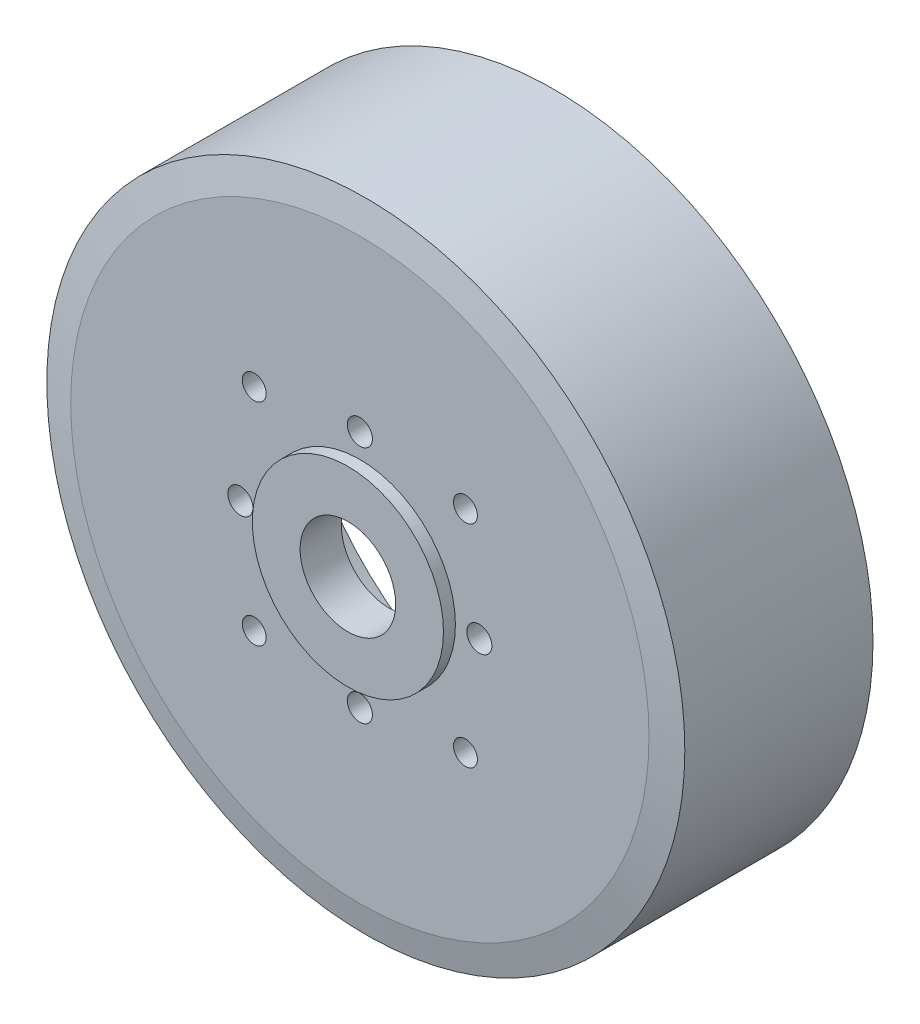
ISO-10303-21;
HEADER;
FILE_DESCRIPTION(('STEP AP214'),'2;1');
FILE_NAME('part.step','',(''),(''),'','','');
FILE_SCHEMA(('AUTOMOTIVE_DESIGN { 1 0 10303 214 1 1 1 1 }'));
ENDSEC;
DATA;
#1=APPLICATION_CONTEXT('core data for automotive mechanical design processes');
#2=APPLICATION_PROTOCOL_DEFINITION('international standard','automotive_design',2000,#1);
#3=PRODUCT_CONTEXT('',#1,'mechanical');
#4=PRODUCT('Part','Part','',(#3));
#5=PRODUCT_RELATED_PRODUCT_CATEGORY('part','',(#4));
#6=PRODUCT_DEFINITION_FORMATION('','',#4);
#7=PRODUCT_DEFINITION_CONTEXT('part definition',#1,'design');
#8=PRODUCT_DEFINITION('design','',#6,#7);
#9=PRODUCT_DEFINITION_SHAPE('','',#8);
#10=(LENGTH_UNIT() NAMED_UNIT(*) SI_UNIT(.MILLI.,.METRE.));
#11=(NAMED_UNIT(*) PLANE_ANGLE_UNIT() SI_UNIT($,.RADIAN.));
#12=(NAMED_UNIT(*) SI_UNIT($,.STERADIAN.) SOLID_ANGLE_UNIT());
#13=UNCERTAINTY_MEASURE_WITH_UNIT(LENGTH_MEASURE(1.E-05),#10,'distance_accuracy_value','');
#14=(GEOMETRIC_REPRESENTATION_CONTEXT(3) GLOBAL_UNCERTAINTY_ASSIGNED_CONTEXT((#13)) GLOBAL_UNIT_ASSIGNED_CONTEXT((#10,
#11,#12)) REPRESENTATION_CONTEXT('',''));
#15=CARTESIAN_POINT('',(0.,0.,0.));
#16=DIRECTION('',(0.,0.,1.));
#17=DIRECTION('',(1.,0.,0.));
#18=AXIS2_PLACEMENT_3D('',#15,#16,#17);
#19=CARTESIAN_POINT('',(0.,0.,-38.5));
#20=DIRECTION('',(0.,0.,1.));
#21=DIRECTION('',(1.,0.,0.));
#22=AXIS2_PLACEMENT_3D('',#19,#20,#21);
#23=CYLINDRICAL_SURFACE('',#22,8.);
#24=CARTESIAN_POINT('',(0.,0.,2.));
#25=DIRECTION('',(0.,0.,1.));
#26=DIRECTION('',(1.,0.,0.));
#27=AXIS2_PLACEMENT_3D('',#24,#25,#26);
#28=CIRCLE('',#27,8.);
#29=CARTESIAN_POINT('',(8.,0.,2.));
#30=VERTEX_POINT('',#29);
#31=EDGE_CURVE('E74',#30,#30,#28,.T.);
#32=ORIENTED_EDGE('',*,*,#31,.T.);
#33=EDGE_LOOP('',(#32));
#34=FACE_BOUND('',#33,.T.);
#35=CARTESIAN_POINT('',(0.,0.,-4.9));
#36=DIRECTION('',(0.,0.,-1.));
#37=DIRECTION('',(-1.,0.,0.));
#38=AXIS2_PLACEMENT_3D('',#35,#36,#37);
#39=CIRCLE('',#38,8.);
#40=CARTESIAN_POINT('',(-8.,0.,-4.9));
#41=VERTEX_POINT('',#40);
#42=EDGE_CURVE('E101',#41,#41,#39,.F.);
#43=ORIENTED_EDGE('',*,*,#42,.F.);
#44=EDGE_LOOP('',(#43));
#45=FACE_BOUND('',#44,.T.);
#46=ADVANCED_FACE('F37',(#34,#45),#23,.F.);
#47=CARTESIAN_POINT('',(17.6776695296637,-17.6776695296637,-20.));
#48=DIRECTION('',(0.,0.,1.));
#49=DIRECTION('',(1.,0.,0.));
#50=AXIS2_PLACEMENT_3D('',#47,#48,#49);
#51=CYLINDRICAL_SURFACE('',#50,2.);
#52=CARTESIAN_POINT('',(17.6776695296637,-17.6776695296637,0.));
#53=DIRECTION('',(0.,0.,1.));
#54=DIRECTION('',(1.,0.,0.));
#55=AXIS2_PLACEMENT_3D('',#52,#53,#54);
#56=CIRCLE('',#55,2.);
#57=CARTESIAN_POINT('',(19.6776695296637,-17.6776695296637,0.));
#58=VERTEX_POINT('',#57);
#59=EDGE_CURVE('E51',#58,#58,#56,.T.);
#60=ORIENTED_EDGE('',*,*,#59,.T.);
#61=EDGE_LOOP('',(#60));
#62=FACE_BOUND('',#61,.T.);
#63=CARTESIAN_POINT('',(17.6776695296637,-17.6776695296637,-4.9));
#64=DIRECTION('',(0.,0.,-1.));
#65=DIRECTION('',(-1.,0.,0.));
#66=AXIS2_PLACEMENT_3D('',#63,#64,#65);
#67=CIRCLE('',#66,2.);
#68=CARTESIAN_POINT('',(15.6776695296637,-17.6776695296637,-4.9));
#69=VERTEX_POINT('',#68);
#70=EDGE_CURVE('E105',#69,#69,#67,.F.);
#71=ORIENTED_EDGE('',*,*,#70,.F.);
#72=EDGE_LOOP('',(#71));
#73=FACE_BOUND('',#72,.T.);
#74=ADVANCED_FACE('F166',(#62,#73),#51,.F.);
#75=CARTESIAN_POINT('',(17.6776695296637,17.6776695296637,-20.));
#76=DIRECTION('',(0.,0.,1.));
#77=DIRECTION('',(1.,0.,0.));
#78=AXIS2_PLACEMENT_3D('',#75,#76,#77);
#79=CYLINDRICAL_SURFACE('',#78,2.);
#80=CARTESIAN_POINT('',(17.6776695296637,17.6776695296637,0.));
#81=DIRECTION('',(0.,0.,1.));
#82=DIRECTION('',(1.,0.,0.));
#83=AXIS2_PLACEMENT_3D('',#80,#81,#82);
#84=CIRCLE('',#83,2.);
#85=CARTESIAN_POINT('',(19.6776695296637,17.6776695296637,0.));
#86=VERTEX_POINT('',#85);
#87=EDGE_CURVE('E57',#86,#86,#84,.T.);
#88=ORIENTED_EDGE('',*,*,#87,.T.);
#89=EDGE_LOOP('',(#88));
#90=FACE_BOUND('',#89,.T.);
#91=CARTESIAN_POINT('',(17.6776695296637,17.6776695296637,-4.9));
#92=DIRECTION('',(0.,0.,-1.));
#93=DIRECTION('',(-1.,0.,0.));
#94=AXIS2_PLACEMENT_3D('',#91,#92,#93);
#95=CIRCLE('',#94,2.);
#96=CARTESIAN_POINT('',(15.6776695296637,17.6776695296637,-4.9));
#97=VERTEX_POINT('',#96);
#98=EDGE_CURVE('E109',#97,#97,#95,.F.);
#99=ORIENTED_EDGE('',*,*,#98,.F.);
#100=EDGE_LOOP('',(#99));
#101=FACE_BOUND('',#100,.T.);
#102=ADVANCED_FACE('F172',(#90,#101),#79,.F.);
#103=CARTESIAN_POINT('',(-17.6776695296638,17.6776695296636,-20.));
#104=DIRECTION('',(0.,0.,1.));
#105=DIRECTION('',(1.,0.,0.));
#106=AXIS2_PLACEMENT_3D('',#103,#104,#105);
#107=CYLINDRICAL_SURFACE('',#106,2.00000000000001);
#108=CARTESIAN_POINT('',(-17.6776695296638,17.6776695296636,0.));
#109=DIRECTION('',(0.,0.,1.));
#110=DIRECTION('',(1.,0.,0.));
#111=AXIS2_PLACEMENT_3D('',#108,#109,#110);
#112=CIRCLE('',#111,2.00000000000001);
#113=CARTESIAN_POINT('',(-15.6776695296638,17.6776695296636,0.));
#114=VERTEX_POINT('',#113);
#115=EDGE_CURVE('E62',#114,#114,#112,.T.);
#116=ORIENTED_EDGE('',*,*,#115,.T.);
#117=EDGE_LOOP('',(#116));
#118=FACE_BOUND('',#117,.T.);
#119=CARTESIAN_POINT('',(-17.6776695296638,17.6776695296636,-4.9));
#120=DIRECTION('',(0.,0.,-1.));
#121=DIRECTION('',(-1.,0.,0.));
#122=AXIS2_PLACEMENT_3D('',#119,#120,#121);
#123=CIRCLE('',#122,2.00000000000001);
#124=CARTESIAN_POINT('',(-19.6776695296638,17.6776695296636,-4.9));
#125=VERTEX_POINT('',#124);
#126=EDGE_CURVE('E113',#125,#125,#123,.F.);
#127=ORIENTED_EDGE('',*,*,#126,.F.);
#128=EDGE_LOOP('',(#127));
#129=FACE_BOUND('',#128,.T.);
#130=ADVANCED_FACE('F222',(#118,#129),#107,.F.);
#131=CARTESIAN_POINT('',(-17.6776695296636,-17.6776695296638,-20.));
#132=DIRECTION('',(0.,0.,1.));
#133=DIRECTION('',(1.,0.,0.));
#134=AXIS2_PLACEMENT_3D('',#131,#132,#133);
#135=CYLINDRICAL_SURFACE('',#134,1.99999999999999);
#136=CARTESIAN_POINT('',(-17.6776695296636,-17.6776695296638,0.));
#137=DIRECTION('',(0.,0.,1.));
#138=DIRECTION('',(1.,0.,0.));
#139=AXIS2_PLACEMENT_3D('',#136,#137,#138);
#140=CIRCLE('',#139,1.99999999999999);
#141=CARTESIAN_POINT('',(-15.6776695296636,-17.6776695296638,0.));
#142=VERTEX_POINT('',#141);
#143=EDGE_CURVE('E58',#142,#142,#140,.T.);
#144=ORIENTED_EDGE('',*,*,#143,.T.);
#145=EDGE_LOOP('',(#144));
#146=FACE_BOUND('',#145,.T.);
#147=CARTESIAN_POINT('',(-17.6776695296636,-17.6776695296638,-4.9));
#148=DIRECTION('',(0.,0.,-1.));
#149=DIRECTION('',(-1.,0.,0.));
#150=AXIS2_PLACEMENT_3D('',#147,#148,#149);
#151=CIRCLE('',#150,1.99999999999999);
#152=CARTESIAN_POINT('',(-19.6776695296636,-17.6776695296638,-4.9));
#153=VERTEX_POINT('',#152);
#154=EDGE_CURVE('E117',#153,#153,#151,.F.);
#155=ORIENTED_EDGE('',*,*,#154,.F.);
#156=EDGE_LOOP('',(#155));
#157=FACE_BOUND('',#156,.T.);
#158=ADVANCED_FACE('F225',(#146,#157),#135,.F.);
#159=CARTESIAN_POINT('',(-20.,0.,-20.));
#160=DIRECTION('',(0.,0.,1.));
#161=DIRECTION('',(1.,0.,0.));
#162=AXIS2_PLACEMENT_3D('',#159,#160,#161);
#163=CYLINDRICAL_SURFACE('',#162,2.1);
#164=CARTESIAN_POINT('',(-20.,0.,0.));
#165=DIRECTION('',(0.,0.,1.));
#166=DIRECTION('',(1.,0.,0.));
#167=AXIS2_PLACEMENT_3D('',#164,#165,#166);
#168=CIRCLE('',#167,2.1);
#169=CARTESIAN_POINT('',(-17.9,0.,0.));
#170=VERTEX_POINT('',#169);
#171=EDGE_CURVE('E82',#170,#170,#168,.T.);
#172=ORIENTED_EDGE('',*,*,#171,.T.);
#173=EDGE_LOOP('',(#172));
#174=FACE_BOUND('',#173,.T.);
#175=CARTESIAN_POINT('',(-20.,0.,-4.9));
#176=DIRECTION('',(0.,0.,-1.));
#177=DIRECTION('',(-1.,0.,0.));
#178=AXIS2_PLACEMENT_3D('',#175,#176,#177);
#179=CIRCLE('',#178,2.1);
#180=CARTESIAN_POINT('',(-22.1,0.,-4.9));
#181=VERTEX_POINT('',#180);
#182=EDGE_CURVE('E121',#181,#181,#179,.F.);
#183=ORIENTED_EDGE('',*,*,#182,.F.);
#184=EDGE_LOOP('',(#183));
#185=FACE_BOUND('',#184,.T.);
#186=ADVANCED_FACE('F228',(#174,#185),#163,.F.);
#187=CARTESIAN_POINT('',(0.,20.,-20.));
#188=DIRECTION('',(0.,0.,1.));
#189=DIRECTION('',(1.,0.,0.));
#190=AXIS2_PLACEMENT_3D('',#187,#188,#189);
#191=CYLINDRICAL_SURFACE('',#190,2.1);
#192=CARTESIAN_POINT('',(0.,20.,0.));
#193=DIRECTION('',(0.,0.,1.));
#194=DIRECTION('',(1.,0.,0.));
#195=AXIS2_PLACEMENT_3D('',#192,#193,#194);
#196=CIRCLE('',#195,2.1);
#197=CARTESIAN_POINT('',(2.1,20.,0.));
#198=VERTEX_POINT('',#197);
#199=EDGE_CURVE('E86',#198,#198,#196,.T.);
#200=ORIENTED_EDGE('',*,*,#199,.T.);
#201=EDGE_LOOP('',(#200));
#202=FACE_BOUND('',#201,.T.);
#203=CARTESIAN_POINT('',(0.,20.,-4.9));
#204=DIRECTION('',(0.,0.,-1.));
#205=DIRECTION('',(-1.,0.,0.));
#206=AXIS2_PLACEMENT_3D('',#203,#204,#205);
#207=CIRCLE('',#206,2.1);
#208=CARTESIAN_POINT('',(-2.1,20.,-4.9));
#209=VERTEX_POINT('',#208);
#210=EDGE_CURVE('E125',#209,#209,#207,.F.);
#211=ORIENTED_EDGE('',*,*,#210,.F.);
#212=EDGE_LOOP('',(#211));
#213=FACE_BOUND('',#212,.T.);
#214=ADVANCED_FACE('F161',(#202,#213),#191,.F.);
#215=CARTESIAN_POINT('',(20.,0.,-20.));
#216=DIRECTION('',(0.,0.,1.));
#217=DIRECTION('',(1.,0.,0.));
#218=AXIS2_PLACEMENT_3D('',#215,#216,#217);
#219=CYLINDRICAL_SURFACE('',#218,2.1);
#220=CARTESIAN_POINT('',(20.,0.,0.));
#221=DIRECTION('',(0.,0.,1.));
#222=DIRECTION('',(1.,0.,0.));
#223=AXIS2_PLACEMENT_3D('',#220,#221,#222);
#224=CIRCLE('',#223,2.1);
#225=CARTESIAN_POINT('',(22.1,0.,0.));
#226=VERTEX_POINT('',#225);
#227=EDGE_CURVE('E91',#226,#226,#224,.T.);
#228=ORIENTED_EDGE('',*,*,#227,.T.);
#229=EDGE_LOOP('',(#228));
#230=FACE_BOUND('',#229,.T.);
#231=CARTESIAN_POINT('',(20.,0.,-4.9));
#232=DIRECTION('',(0.,0.,-1.));
#233=DIRECTION('',(-1.,0.,0.));
#234=AXIS2_PLACEMENT_3D('',#231,#232,#233);
#235=CIRCLE('',#234,2.1);
#236=CARTESIAN_POINT('',(17.9,0.,-4.9));
#237=VERTEX_POINT('',#236);
#238=EDGE_CURVE('E129',#237,#237,#235,.F.);
#239=ORIENTED_EDGE('',*,*,#238,.F.);
#240=EDGE_LOOP('',(#239));
#241=FACE_BOUND('',#240,.T.);
#242=ADVANCED_FACE('F152',(#230,#241),#219,.F.);
#243=CARTESIAN_POINT('',(0.,-20.,-20.));
#244=DIRECTION('',(0.,0.,1.));
#245=DIRECTION('',(1.,0.,0.));
#246=AXIS2_PLACEMENT_3D('',#243,#244,#245);
#247=CYLINDRICAL_SURFACE('',#246,2.1);
#248=CARTESIAN_POINT('',(0.,-20.,0.));
#249=DIRECTION('',(0.,0.,1.));
#250=DIRECTION('',(1.,0.,0.));
#251=AXIS2_PLACEMENT_3D('',#248,#249,#250);
#252=CIRCLE('',#251,2.1);
#253=CARTESIAN_POINT('',(2.1,-20.,0.));
#254=VERTEX_POINT('',#253);
#255=EDGE_CURVE('E81',#254,#254,#252,.T.);
#256=ORIENTED_EDGE('',*,*,#255,.T.);
#257=EDGE_LOOP('',(#256));
#258=FACE_BOUND('',#257,.T.);
#259=CARTESIAN_POINT('',(0.,-20.,-4.9));
#260=DIRECTION('',(0.,0.,-1.));
#261=DIRECTION('',(-1.,0.,0.));
#262=AXIS2_PLACEMENT_3D('',#259,#260,#261);
#263=CIRCLE('',#262,2.1);
#264=CARTESIAN_POINT('',(-2.1,-20.,-4.9));
#265=VERTEX_POINT('',#264);
#266=EDGE_CURVE('E41',#265,#265,#263,.F.);
#267=ORIENTED_EDGE('',*,*,#266,.F.);
#268=EDGE_LOOP('',(#267));
#269=FACE_BOUND('',#268,.T.);
#270=ADVANCED_FACE('F149',(#258,#269),#247,.F.);
#271=CARTESIAN_POINT('',(0.,0.,-38.5));
#272=DIRECTION('',(0.,0.,1.));
#273=DIRECTION('',(1.,0.,0.));
#274=AXIS2_PLACEMENT_3D('',#271,#272,#273);
#275=CYLINDRICAL_SURFACE('',#274,53.4);
#276=CARTESIAN_POINT('',(0.,0.,-0.999999999999994));
#277=DIRECTION('',(0.,0.,1.));
#278=DIRECTION('',(1.,0.,0.));
#279=AXIS2_PLACEMENT_3D('',#276,#277,#278);
#280=CIRCLE('',#279,53.4);
#281=CARTESIAN_POINT('',(53.4,0.,-0.999999999999994));
#282=VERTEX_POINT('',#281);
#283=EDGE_CURVE('E10',#282,#282,#280,.F.);
#284=ORIENTED_EDGE('',*,*,#283,.T.);
#285=EDGE_LOOP('',(#284));
#286=FACE_BOUND('',#285,.T.);
#287=CARTESIAN_POINT('',(0.,0.,-32.5));
#288=DIRECTION('',(0.,0.,-1.));
#289=DIRECTION('',(-1.,0.,0.));
#290=AXIS2_PLACEMENT_3D('',#287,#288,#289);
#291=CIRCLE('',#290,53.4);
#292=CARTESIAN_POINT('',(-53.4,0.,-32.5));
#293=VERTEX_POINT('',#292);
#294=EDGE_CURVE('E87',#293,#293,#291,.T.);
#295=ORIENTED_EDGE('',*,*,#294,.F.);
#296=EDGE_LOOP('',(#295));
#297=FACE_BOUND('',#296,.T.);
#298=ADVANCED_FACE('F151',(#286,#297),#275,.T.);
#299=CARTESIAN_POINT('',(0.,0.,0.));
#300=DIRECTION('',(0.,0.,1.));
#301=DIRECTION('',(1.,0.,0.));
#302=AXIS2_PLACEMENT_3D('',#299,#300,#301);
#303=PLANE('',#302);
#304=CARTESIAN_POINT('',(0.,0.,0.));
#305=DIRECTION('',(0.,0.,1.));
#306=DIRECTION('',(1.,0.,0.));
#307=AXIS2_PLACEMENT_3D('',#304,#305,#306);
#308=CIRCLE('',#307,48.3999999999999);
#309=CARTESIAN_POINT('',(48.3999999999999,0.,0.));
#310=VERTEX_POINT('',#309);
#311=EDGE_CURVE('E46',#310,#310,#308,.T.);
#312=ORIENTED_EDGE('',*,*,#311,.T.);
#313=EDGE_LOOP('',(#312));
#314=FACE_BOUND('',#313,.T.);
#315=ORIENTED_EDGE('',*,*,#255,.F.);
#316=EDGE_LOOP('',(#315));
#317=FACE_BOUND('',#316,.T.);
#318=ORIENTED_EDGE('',*,*,#227,.F.);
#319=EDGE_LOOP('',(#318));
#320=FACE_BOUND('',#319,.T.);
#321=ORIENTED_EDGE('',*,*,#199,.F.);
#322=EDGE_LOOP('',(#321));
#323=FACE_BOUND('',#322,.T.);
#324=ORIENTED_EDGE('',*,*,#171,.F.);
#325=EDGE_LOOP('',(#324));
#326=FACE_BOUND('',#325,.T.);
#327=ORIENTED_EDGE('',*,*,#59,.F.);
#328=EDGE_LOOP('',(#327));
#329=FACE_BOUND('',#328,.T.);
#330=ORIENTED_EDGE('',*,*,#87,.F.);
#331=EDGE_LOOP('',(#330));
#332=FACE_BOUND('',#331,.T.);
#333=ORIENTED_EDGE('',*,*,#115,.F.);
#334=EDGE_LOOP('',(#333));
#335=FACE_BOUND('',#334,.T.);
#336=ORIENTED_EDGE('',*,*,#143,.F.);
#337=EDGE_LOOP('',(#336));
#338=FACE_BOUND('',#337,.T.);
#339=CARTESIAN_POINT('',(0.,0.,0.));
#340=DIRECTION('',(0.,0.,1.));
#341=DIRECTION('',(1.,0.,0.));
#342=AXIS2_PLACEMENT_3D('',#339,#340,#341);
#343=CIRCLE('',#342,16.);
#344=CARTESIAN_POINT('',(16.,0.,0.));
#345=VERTEX_POINT('',#344);
#346=EDGE_CURVE('E70',#345,#345,#343,.T.);
#347=ORIENTED_EDGE('',*,*,#346,.F.);
#348=EDGE_LOOP('',(#347));
#349=FACE_BOUND('',#348,.T.);
#350=ADVANCED_FACE('F160',(#314,#317,#320,#323,#326,#329,#332,#335,#338,#349),#303,.T.);
#351=CARTESIAN_POINT('',(0.,0.,2.));
#352=DIRECTION('',(0.,0.,1.));
#353=DIRECTION('',(1.,0.,0.));
#354=AXIS2_PLACEMENT_3D('',#351,#352,#353);
#355=PLANE('',#354);
#356=CARTESIAN_POINT('',(0.,0.,2.));
#357=DIRECTION('',(0.,0.,1.));
#358=DIRECTION('',(1.,0.,0.));
#359=AXIS2_PLACEMENT_3D('',#356,#357,#358);
#360=CIRCLE('',#359,16.);
#361=CARTESIAN_POINT('',(16.,0.,2.));
#362=VERTEX_POINT('',#361);
#363=EDGE_CURVE('E63',#362,#362,#360,.T.);
#364=ORIENTED_EDGE('',*,*,#363,.T.);
#365=EDGE_LOOP('',(#364));
#366=FACE_BOUND('',#365,.T.);
#367=ORIENTED_EDGE('',*,*,#31,.F.);
#368=EDGE_LOOP('',(#367));
#369=FACE_BOUND('',#368,.T.);
#370=ADVANCED_FACE('F179',(#366,#369),#355,.T.);
#371=CARTESIAN_POINT('',(0.,0.,2.));
#372=DIRECTION('',(0.,0.,-1.));
#373=DIRECTION('',(-1.,0.,0.));
#374=AXIS2_PLACEMENT_3D('',#371,#372,#373);
#375=CYLINDRICAL_SURFACE('',#374,16.);
#376=ORIENTED_EDGE('',*,*,#363,.F.);
#377=EDGE_LOOP('',(#376));
#378=FACE_BOUND('',#377,.T.);
#379=ORIENTED_EDGE('',*,*,#346,.T.);
#380=EDGE_LOOP('',(#379));
#381=FACE_BOUND('',#380,.T.);
#382=ADVANCED_FACE('F186',(#378,#381),#375,.T.);
#383=CARTESIAN_POINT('',(0.,0.,0.));
#384=DIRECTION('',(0.,0.,-1.));
#385=DIRECTION('',(-1.,0.,0.));
#386=AXIS2_PLACEMENT_3D('',#383,#384,#385);
#387=CONICAL_SURFACE('',#386,48.3999999999999,1.37340076694502);
#388=ORIENTED_EDGE('',*,*,#283,.F.);
#389=EDGE_LOOP('',(#388));
#390=FACE_BOUND('',#389,.T.);
#391=ORIENTED_EDGE('',*,*,#311,.F.);
#392=EDGE_LOOP('',(#391));
#393=FACE_BOUND('',#392,.T.);
#394=ADVANCED_FACE('F39',(#390,#393),#387,.T.);
#395=CARTESIAN_POINT('',(0.,0.,-32.5));
#396=DIRECTION('',(0.,0.,-1.));
#397=DIRECTION('',(-1.,0.,0.));
#398=AXIS2_PLACEMENT_3D('',#395,#396,#397);
#399=PLANE('',#398);
#400=CARTESIAN_POINT('',(0.,0.,-32.5));
#401=DIRECTION('',(0.,0.,-1.));
#402=DIRECTION('',(-1.,0.,0.));
#403=AXIS2_PLACEMENT_3D('',#400,#401,#402);
#404=CIRCLE('',#403,44.75);
#405=CARTESIAN_POINT('',(-44.75,0.,-32.5));
#406=VERTEX_POINT('',#405);
#407=EDGE_CURVE('E133',#406,#406,#404,.T.);
#408=ORIENTED_EDGE('',*,*,#407,.F.);
#409=EDGE_LOOP('',(#408));
#410=FACE_BOUND('',#409,.T.);
#411=ORIENTED_EDGE('',*,*,#294,.T.);
#412=EDGE_LOOP('',(#411));
#413=FACE_BOUND('',#412,.T.);
#414=ADVANCED_FACE('F215',(#410,#413),#399,.T.);
#415=CARTESIAN_POINT('',(0.,0.,-4.9));
#416=DIRECTION('',(0.,0.,-1.));
#417=DIRECTION('',(-1.,0.,0.));
#418=AXIS2_PLACEMENT_3D('',#415,#416,#417);
#419=PLANE('',#418);
#420=CARTESIAN_POINT('',(0.,0.,-4.9));
#421=DIRECTION('',(0.,0.,-1.));
#422=DIRECTION('',(-1.,0.,0.));
#423=AXIS2_PLACEMENT_3D('',#420,#421,#422);
#424=CIRCLE('',#423,44.75);
#425=CARTESIAN_POINT('',(-44.75,0.,-4.9));
#426=VERTEX_POINT('',#425);
#427=EDGE_CURVE('E137',#426,#426,#424,.T.);
#428=ORIENTED_EDGE('',*,*,#427,.T.);
#429=EDGE_LOOP('',(#428));
#430=FACE_BOUND('',#429,.T.);
#431=ORIENTED_EDGE('',*,*,#266,.T.);
#432=EDGE_LOOP('',(#431));
#433=FACE_BOUND('',#432,.T.);
#434=ORIENTED_EDGE('',*,*,#238,.T.);
#435=EDGE_LOOP('',(#434));
#436=FACE_BOUND('',#435,.T.);
#437=ORIENTED_EDGE('',*,*,#210,.T.);
#438=EDGE_LOOP('',(#437));
#439=FACE_BOUND('',#438,.T.);
#440=ORIENTED_EDGE('',*,*,#182,.T.);
#441=EDGE_LOOP('',(#440));
#442=FACE_BOUND('',#441,.T.);
#443=ORIENTED_EDGE('',*,*,#154,.T.);
#444=EDGE_LOOP('',(#443));
#445=FACE_BOUND('',#444,.T.);
#446=ORIENTED_EDGE('',*,*,#126,.T.);
#447=EDGE_LOOP('',(#446));
#448=FACE_BOUND('',#447,.T.);
#449=ORIENTED_EDGE('',*,*,#98,.T.);
#450=EDGE_LOOP('',(#449));
#451=FACE_BOUND('',#450,.T.);
#452=ORIENTED_EDGE('',*,*,#70,.T.);
#453=EDGE_LOOP('',(#452));
#454=FACE_BOUND('',#453,.T.);
#455=ORIENTED_EDGE('',*,*,#42,.T.);
#456=EDGE_LOOP('',(#455));
#457=FACE_BOUND('',#456,.T.);
#458=ADVANCED_FACE('F146',(#430,#433,#436,#439,#442,#445,#448,#451,#454,#457),#419,.T.);
#459=CARTESIAN_POINT('',(0.,0.,-4.9));
#460=DIRECTION('',(0.,0.,-1.));
#461=DIRECTION('',(-1.,0.,0.));
#462=AXIS2_PLACEMENT_3D('',#459,#460,#461);
#463=CYLINDRICAL_SURFACE('',#462,44.75);
#464=CARTESIAN_POINT('',(-44.75,0.,-4.9));
#465=CARTESIAN_POINT('',(-44.75,0.,-5.1875));
#466=CARTESIAN_POINT('',(-44.75,0.,-5.475));
#467=CARTESIAN_POINT('',(-44.75,0.,-6.05));
#468=CARTESIAN_POINT('',(-44.75,0.,-6.3375));
#469=CARTESIAN_POINT('',(-44.75,0.,-6.9125));
#470=CARTESIAN_POINT('',(-44.75,0.,-7.2));
#471=CARTESIAN_POINT('',(-44.75,0.,-7.775));
#472=CARTESIAN_POINT('',(-44.75,0.,-8.0625));
#473=CARTESIAN_POINT('',(-44.75,0.,-8.6375));
#474=CARTESIAN_POINT('',(-44.75,0.,-8.925));
#475=CARTESIAN_POINT('',(-44.75,0.,-9.5));
#476=CARTESIAN_POINT('',(-44.75,0.,-9.7875));
#477=CARTESIAN_POINT('',(-44.75,0.,-10.3625));
#478=CARTESIAN_POINT('',(-44.75,0.,-10.65));
#479=CARTESIAN_POINT('',(-44.75,0.,-11.225));
#480=CARTESIAN_POINT('',(-44.75,0.,-11.5125));
#481=CARTESIAN_POINT('',(-44.75,0.,-12.0875));
#482=CARTESIAN_POINT('',(-44.75,0.,-12.375));
#483=CARTESIAN_POINT('',(-44.75,0.,-12.95));
#484=CARTESIAN_POINT('',(-44.75,0.,-13.2375));
#485=CARTESIAN_POINT('',(-44.75,0.,-13.8125));
#486=CARTESIAN_POINT('',(-44.75,0.,-14.1));
#487=CARTESIAN_POINT('',(-44.75,0.,-14.675));
#488=CARTESIAN_POINT('',(-44.75,0.,-14.9625));
#489=CARTESIAN_POINT('',(-44.75,0.,-15.5375));
#490=CARTESIAN_POINT('',(-44.75,0.,-15.825));
#491=CARTESIAN_POINT('',(-44.75,0.,-16.4));
#492=CARTESIAN_POINT('',(-44.75,0.,-16.6875));
#493=CARTESIAN_POINT('',(-44.75,0.,-17.2625));
#494=CARTESIAN_POINT('',(-44.75,0.,-17.55));
#495=CARTESIAN_POINT('',(-44.75,0.,-18.125));
#496=CARTESIAN_POINT('',(-44.75,0.,-18.4125));
#497=CARTESIAN_POINT('',(-44.75,0.,-18.9875));
#498=CARTESIAN_POINT('',(-44.75,0.,-19.275));
#499=CARTESIAN_POINT('',(-44.75,0.,-19.85));
#500=CARTESIAN_POINT('',(-44.75,0.,-20.1375));
#501=CARTESIAN_POINT('',(-44.75,0.,-20.7125));
#502=CARTESIAN_POINT('',(-44.75,0.,-21.));
#503=CARTESIAN_POINT('',(-44.75,0.,-21.575));
#504=CARTESIAN_POINT('',(-44.75,0.,-21.8625));
#505=CARTESIAN_POINT('',(-44.75,0.,-22.4375));
#506=CARTESIAN_POINT('',(-44.75,0.,-22.725));
#507=CARTESIAN_POINT('',(-44.75,0.,-23.3));
#508=CARTESIAN_POINT('',(-44.75,0.,-23.5875));
#509=CARTESIAN_POINT('',(-44.75,0.,-24.1625));
#510=CARTESIAN_POINT('',(-44.75,0.,-24.45));
#511=CARTESIAN_POINT('',(-44.75,0.,-25.025));
#512=CARTESIAN_POINT('',(-44.75,0.,-25.3125));
#513=CARTESIAN_POINT('',(-44.75,0.,-25.8875));
#514=CARTESIAN_POINT('',(-44.75,0.,-26.175));
#515=CARTESIAN_POINT('',(-44.75,0.,-26.75));
#516=CARTESIAN_POINT('',(-44.75,0.,-27.0375));
#517=CARTESIAN_POINT('',(-44.75,0.,-27.6125));
#518=CARTESIAN_POINT('',(-44.75,0.,-27.9));
#519=CARTESIAN_POINT('',(-44.75,0.,-28.475));
#520=CARTESIAN_POINT('',(-44.75,0.,-28.7625));
#521=CARTESIAN_POINT('',(-44.75,0.,-29.3375));
#522=CARTESIAN_POINT('',(-44.75,0.,-29.625));
#523=CARTESIAN_POINT('',(-44.75,0.,-30.2));
#524=CARTESIAN_POINT('',(-44.75,0.,-30.4875));
#525=CARTESIAN_POINT('',(-44.75,0.,-31.0625));
#526=CARTESIAN_POINT('',(-44.75,0.,-31.35));
#527=CARTESIAN_POINT('',(-44.75,0.,-31.925));
#528=CARTESIAN_POINT('',(-44.75,0.,-32.2125));
#529=CARTESIAN_POINT('',(-44.75,0.,-32.5));
#530=B_SPLINE_CURVE_WITH_KNOTS('',3,(#464,#465,#466,#467,#468,#469,#470,#471,#472,#473,#474,
#475,#476,#477,#478,#479,#480,#481,#482,#483,#484,#485,#486,#487,#488,#489,#490,#491,#492,#493,
#494,#495,#496,#497,#498,#499,#500,#501,#502,#503,#504,#505,#506,#507,#508,#509,#510,#511,#512,
#513,#514,#515,#516,#517,#518,#519,#520,#521,#522,#523,#524,#525,#526,#527,#528,#529),
.UNSPECIFIED.,.F.,.F.,(4,2,2,2,2,2,2,2,2,2,2,2,2,2,2,2,2,2,2,2,2,2,2,2,2,2,2,2,2,2,2,2,4),(0.,
0.8625,1.725,2.5875,3.45,4.3125,5.175,6.0375,6.9,7.7625,8.625,9.4875,10.35,11.2125,12.075,
12.9375,13.8,14.6625,15.525,16.3875,17.25,18.1125,18.975,19.8375,20.7,21.5625,22.425,23.2875,
24.15,25.0125,25.875,26.7375,27.6),.UNSPECIFIED.);
#531=EDGE_CURVE('BSEAM239',#426,#406,#530,.T.);
#532=ORIENTED_EDGE('',*,*,#427,.F.);
#533=ORIENTED_EDGE('',*,*,#407,.T.);
#534=ORIENTED_EDGE('',*,*,#531,.T.);
#535=ORIENTED_EDGE('',*,*,#531,.F.);
#536=EDGE_LOOP('',(#532,#534,#533,#535));
#537=FACE_BOUND('',#536,.T.);
#538=ADVANCED_FACE('F239',(#537),#463,.F.);
#539=CLOSED_SHELL('',(#46,#74,#102,#130,#158,#186,#214,#242,#270,#298,#350,#370,#382,#394,#414,
#458,#538));
#540=MANIFOLD_SOLID_BREP('B2',#539);
#541=ADVANCED_BREP_SHAPE_REPRESENTATION('',(#18,#540),#14);
#542=SHAPE_DEFINITION_REPRESENTATION(#9,#541);
ENDSEC;
END-ISO-10303-21;
